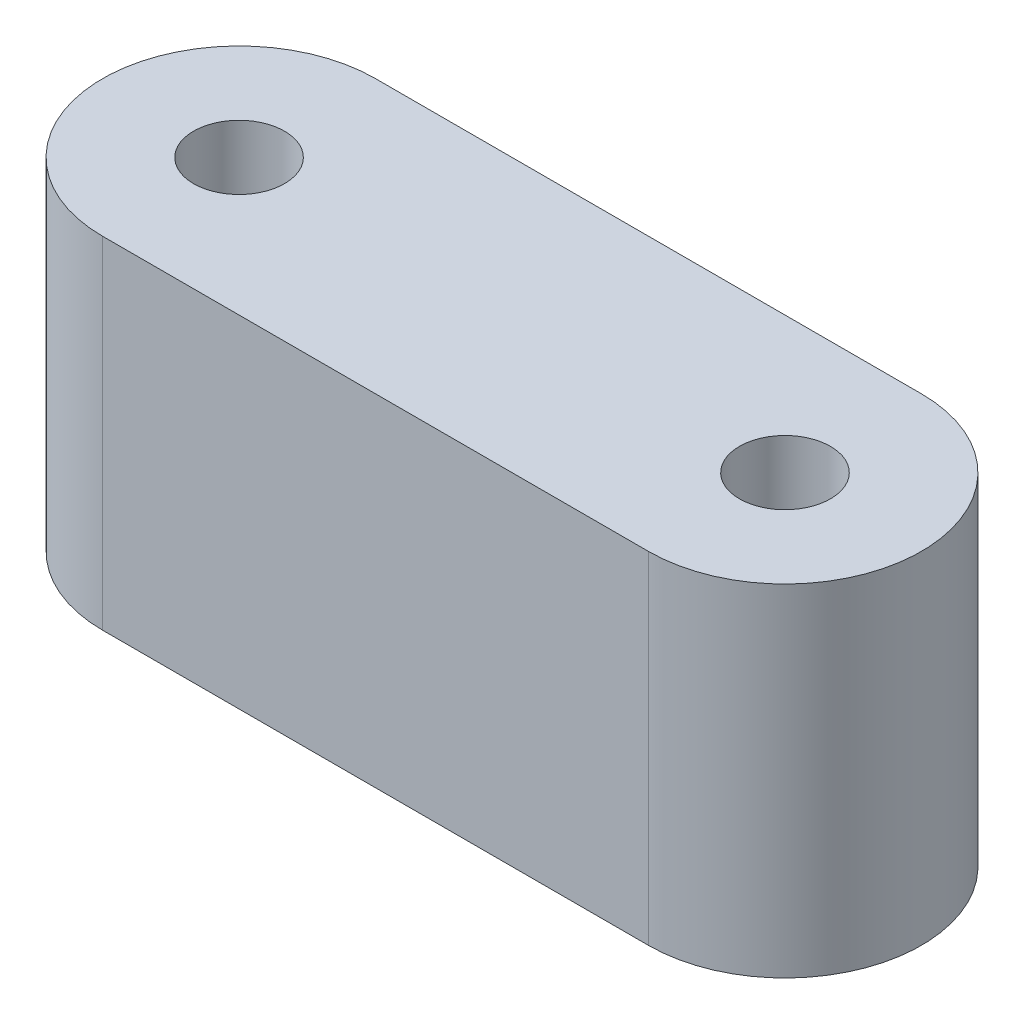
ISO-10303-21;
HEADER;
FILE_DESCRIPTION(('STEP AP214'),'2;1');
FILE_NAME('part.step','',(''),(''),'','','');
FILE_SCHEMA(('AUTOMOTIVE_DESIGN { 1 0 10303 214 1 1 1 1 }'));
ENDSEC;
DATA;
#1=APPLICATION_CONTEXT('core data for automotive mechanical design processes');
#2=APPLICATION_PROTOCOL_DEFINITION('international standard','automotive_design',2000,#1);
#3=PRODUCT_CONTEXT('',#1,'mechanical');
#4=PRODUCT('Part','Part','',(#3));
#5=PRODUCT_RELATED_PRODUCT_CATEGORY('part','',(#4));
#6=PRODUCT_DEFINITION_FORMATION('','',#4);
#7=PRODUCT_DEFINITION_CONTEXT('part definition',#1,'design');
#8=PRODUCT_DEFINITION('design','',#6,#7);
#9=PRODUCT_DEFINITION_SHAPE('','',#8);
#10=(LENGTH_UNIT() NAMED_UNIT(*) SI_UNIT(.MILLI.,.METRE.));
#11=(NAMED_UNIT(*) PLANE_ANGLE_UNIT() SI_UNIT($,.RADIAN.));
#12=(NAMED_UNIT(*) SI_UNIT($,.STERADIAN.) SOLID_ANGLE_UNIT());
#13=UNCERTAINTY_MEASURE_WITH_UNIT(LENGTH_MEASURE(1.E-05),#10,'distance_accuracy_value','');
#14=(GEOMETRIC_REPRESENTATION_CONTEXT(3) GLOBAL_UNCERTAINTY_ASSIGNED_CONTEXT((#13)) GLOBAL_UNIT_ASSIGNED_CONTEXT((#10,
#11,#12)) REPRESENTATION_CONTEXT('',''));
#15=CARTESIAN_POINT('',(0.,0.,0.));
#16=DIRECTION('',(0.,0.,1.));
#17=DIRECTION('',(1.,0.,0.));
#18=AXIS2_PLACEMENT_3D('',#15,#16,#17);
#19=CARTESIAN_POINT('',(-12.,15.,0.));
#20=DIRECTION('',(0.,1.,0.));
#21=DIRECTION('',(0.,0.,1.));
#22=AXIS2_PLACEMENT_3D('',#19,#20,#21);
#23=PLANE('',#22);
#24=CARTESIAN_POINT('',(-12.,15.,0.));
#25=DIRECTION('',(0.,1.,0.));
#26=DIRECTION('',(0.,0.,1.));
#27=AXIS2_PLACEMENT_3D('',#24,#25,#26);
#28=CIRCLE('',#27,2.);
#29=CARTESIAN_POINT('',(-12.,15.,2.));
#30=VERTEX_POINT('',#29);
#31=EDGE_CURVE('E104',#30,#30,#28,.T.);
#32=ORIENTED_EDGE('',*,*,#31,.F.);
#33=EDGE_LOOP('',(#32));
#34=FACE_BOUND('',#33,.T.);
#35=CARTESIAN_POINT('',(-12.,15.,0.));
#36=DIRECTION('',(0.,1.,0.));
#37=DIRECTION('',(0.,0.,1.));
#38=AXIS2_PLACEMENT_3D('',#35,#36,#37);
#39=CIRCLE('',#38,6.);
#40=CARTESIAN_POINT('',(-12.,15.,-6.));
#41=VERTEX_POINT('',#40);
#42=CARTESIAN_POINT('',(-12.,15.,6.));
#43=VERTEX_POINT('',#42);
#44=EDGE_CURVE('E89',#41,#43,#39,.T.);
#45=ORIENTED_EDGE('',*,*,#44,.T.);
#46=DIRECTION('',(1.,0.,0.));
#47=VECTOR('',#46,1.);
#48=CARTESIAN_POINT('',(-12.,15.,6.));
#49=LINE('',#48,#47);
#50=CARTESIAN_POINT('',(12.,15.,6.));
#51=VERTEX_POINT('',#50);
#52=EDGE_CURVE('E84',#43,#51,#49,.T.);
#53=ORIENTED_EDGE('',*,*,#52,.T.);
#54=CARTESIAN_POINT('',(12.,15.,0.));
#55=DIRECTION('',(0.,1.,0.));
#56=DIRECTION('',(0.,0.,1.));
#57=AXIS2_PLACEMENT_3D('',#54,#55,#56);
#58=CIRCLE('',#57,6.);
#59=CARTESIAN_POINT('',(12.,15.,-6.));
#60=VERTEX_POINT('',#59);
#61=EDGE_CURVE('E87',#51,#60,#58,.T.);
#62=ORIENTED_EDGE('',*,*,#61,.T.);
#63=DIRECTION('',(-1.,0.,0.));
#64=VECTOR('',#63,1.);
#65=CARTESIAN_POINT('',(-12.,15.,-6.));
#66=LINE('',#65,#64);
#67=EDGE_CURVE('E54',#60,#41,#66,.T.);
#68=ORIENTED_EDGE('',*,*,#67,.T.);
#69=EDGE_LOOP('',(#45,#53,#62,#68));
#70=FACE_BOUND('',#69,.T.);
#71=CARTESIAN_POINT('',(12.,15.,0.));
#72=DIRECTION('',(0.,1.,0.));
#73=DIRECTION('',(0.,0.,1.));
#74=AXIS2_PLACEMENT_3D('',#71,#72,#73);
#75=CIRCLE('',#74,2.);
#76=CARTESIAN_POINT('',(12.,15.,2.));
#77=VERTEX_POINT('',#76);
#78=EDGE_CURVE('E119',#77,#77,#75,.T.);
#79=ORIENTED_EDGE('',*,*,#78,.F.);
#80=EDGE_LOOP('',(#79));
#81=FACE_BOUND('',#80,.T.);
#82=ADVANCED_FACE('F37',(#34,#70,#81),#23,.T.);
#83=CARTESIAN_POINT('',(-12.,0.,0.));
#84=DIRECTION('',(0.,1.,0.));
#85=DIRECTION('',(0.,0.,1.));
#86=AXIS2_PLACEMENT_3D('',#83,#84,#85);
#87=PLANE('',#86);
#88=CARTESIAN_POINT('',(-12.,0.,0.));
#89=DIRECTION('',(0.,1.,0.));
#90=DIRECTION('',(0.,0.,1.));
#91=AXIS2_PLACEMENT_3D('',#88,#89,#90);
#92=CIRCLE('',#91,6.);
#93=CARTESIAN_POINT('',(-12.,0.,-6.));
#94=VERTEX_POINT('',#93);
#95=CARTESIAN_POINT('',(-12.,0.,6.));
#96=VERTEX_POINT('',#95);
#97=EDGE_CURVE('E101',#94,#96,#92,.T.);
#98=ORIENTED_EDGE('',*,*,#97,.F.);
#99=DIRECTION('',(-1.,0.,0.));
#100=VECTOR('',#99,1.);
#101=CARTESIAN_POINT('',(-12.,0.,-6.));
#102=LINE('',#101,#100);
#103=CARTESIAN_POINT('',(12.,0.,-6.));
#104=VERTEX_POINT('',#103);
#105=EDGE_CURVE('E77',#104,#94,#102,.T.);
#106=ORIENTED_EDGE('',*,*,#105,.F.);
#107=CARTESIAN_POINT('',(12.,0.,0.));
#108=DIRECTION('',(0.,1.,0.));
#109=DIRECTION('',(0.,0.,1.));
#110=AXIS2_PLACEMENT_3D('',#107,#108,#109);
#111=CIRCLE('',#110,6.);
#112=CARTESIAN_POINT('',(12.,0.,6.));
#113=VERTEX_POINT('',#112);
#114=EDGE_CURVE('E71',#113,#104,#111,.T.);
#115=ORIENTED_EDGE('',*,*,#114,.F.);
#116=DIRECTION('',(1.,0.,0.));
#117=VECTOR('',#116,1.);
#118=CARTESIAN_POINT('',(-12.,0.,6.));
#119=LINE('',#118,#117);
#120=EDGE_CURVE('E93',#96,#113,#119,.T.);
#121=ORIENTED_EDGE('',*,*,#120,.F.);
#122=EDGE_LOOP('',(#98,#106,#115,#121));
#123=FACE_BOUND('',#122,.T.);
#124=CARTESIAN_POINT('',(-12.,0.,0.));
#125=DIRECTION('',(0.,1.,0.));
#126=DIRECTION('',(0.,0.,1.));
#127=AXIS2_PLACEMENT_3D('',#124,#125,#126);
#128=CIRCLE('',#127,2.);
#129=CARTESIAN_POINT('',(-12.,0.,2.));
#130=VERTEX_POINT('',#129);
#131=EDGE_CURVE('E116',#130,#130,#128,.T.);
#132=ORIENTED_EDGE('',*,*,#131,.T.);
#133=EDGE_LOOP('',(#132));
#134=FACE_BOUND('',#133,.T.);
#135=CARTESIAN_POINT('',(12.,0.,0.));
#136=DIRECTION('',(0.,1.,0.));
#137=DIRECTION('',(0.,0.,1.));
#138=AXIS2_PLACEMENT_3D('',#135,#136,#137);
#139=CIRCLE('',#138,2.);
#140=CARTESIAN_POINT('',(12.,0.,2.));
#141=VERTEX_POINT('',#140);
#142=EDGE_CURVE('E122',#141,#141,#139,.T.);
#143=ORIENTED_EDGE('',*,*,#142,.T.);
#144=EDGE_LOOP('',(#143));
#145=FACE_BOUND('',#144,.T.);
#146=ADVANCED_FACE('F112',(#123,#134,#145),#87,.F.);
#147=CARTESIAN_POINT('',(-12.,15.,0.));
#148=DIRECTION('',(0.,-1.,0.));
#149=DIRECTION('',(0.,0.,-1.));
#150=AXIS2_PLACEMENT_3D('',#147,#148,#149);
#151=CYLINDRICAL_SURFACE('',#150,6.);
#152=ORIENTED_EDGE('',*,*,#97,.T.);
#153=DIRECTION('',(0.,-1.,0.));
#154=VECTOR('',#153,1.);
#155=CARTESIAN_POINT('',(-12.,15.,6.));
#156=LINE('',#155,#154);
#157=EDGE_CURVE('E11',#43,#96,#156,.T.);
#158=ORIENTED_EDGE('',*,*,#157,.F.);
#159=ORIENTED_EDGE('',*,*,#44,.F.);
#160=DIRECTION('',(0.,-1.,0.));
#161=VECTOR('',#160,1.);
#162=CARTESIAN_POINT('',(-12.,15.,-6.));
#163=LINE('',#162,#161);
#164=EDGE_CURVE('E97',#41,#94,#163,.T.);
#165=ORIENTED_EDGE('',*,*,#164,.T.);
#166=EDGE_LOOP('',(#152,#158,#159,#165));
#167=FACE_BOUND('',#166,.T.);
#168=ADVANCED_FACE('F39',(#167),#151,.T.);
#169=CARTESIAN_POINT('',(-12.,15.,6.));
#170=DIRECTION('',(0.,0.,-1.));
#171=DIRECTION('',(-1.,0.,0.));
#172=AXIS2_PLACEMENT_3D('',#169,#170,#171);
#173=PLANE('',#172);
#174=ORIENTED_EDGE('',*,*,#120,.T.);
#175=DIRECTION('',(0.,-1.,0.));
#176=VECTOR('',#175,1.);
#177=CARTESIAN_POINT('',(12.,15.,6.));
#178=LINE('',#177,#176);
#179=EDGE_CURVE('E46',#51,#113,#178,.T.);
#180=ORIENTED_EDGE('',*,*,#179,.F.);
#181=ORIENTED_EDGE('',*,*,#52,.F.);
#182=ORIENTED_EDGE('',*,*,#157,.T.);
#183=EDGE_LOOP('',(#174,#180,#181,#182));
#184=FACE_BOUND('',#183,.T.);
#185=ADVANCED_FACE('F92',(#184),#173,.F.);
#186=CARTESIAN_POINT('',(12.,15.,0.));
#187=DIRECTION('',(0.,-1.,0.));
#188=DIRECTION('',(0.,0.,-1.));
#189=AXIS2_PLACEMENT_3D('',#186,#187,#188);
#190=CYLINDRICAL_SURFACE('',#189,6.);
#191=ORIENTED_EDGE('',*,*,#114,.T.);
#192=DIRECTION('',(0.,-1.,0.));
#193=VECTOR('',#192,1.);
#194=CARTESIAN_POINT('',(12.,15.,-6.));
#195=LINE('',#194,#193);
#196=EDGE_CURVE('E94',#60,#104,#195,.T.);
#197=ORIENTED_EDGE('',*,*,#196,.F.);
#198=ORIENTED_EDGE('',*,*,#61,.F.);
#199=ORIENTED_EDGE('',*,*,#179,.T.);
#200=EDGE_LOOP('',(#191,#197,#198,#199));
#201=FACE_BOUND('',#200,.T.);
#202=ADVANCED_FACE('F95',(#201),#190,.T.);
#203=CARTESIAN_POINT('',(-12.,15.,-6.));
#204=DIRECTION('',(0.,0.,1.));
#205=DIRECTION('',(1.,0.,0.));
#206=AXIS2_PLACEMENT_3D('',#203,#204,#205);
#207=PLANE('',#206);
#208=ORIENTED_EDGE('',*,*,#105,.T.);
#209=ORIENTED_EDGE('',*,*,#164,.F.);
#210=ORIENTED_EDGE('',*,*,#67,.F.);
#211=ORIENTED_EDGE('',*,*,#196,.T.);
#212=EDGE_LOOP('',(#208,#209,#210,#211));
#213=FACE_BOUND('',#212,.T.);
#214=ADVANCED_FACE('F109',(#213),#207,.F.);
#215=CARTESIAN_POINT('',(-12.,15.,0.));
#216=DIRECTION('',(0.,-1.,0.));
#217=DIRECTION('',(0.,0.,-1.));
#218=AXIS2_PLACEMENT_3D('',#215,#216,#217);
#219=CYLINDRICAL_SURFACE('',#218,2.);
#220=ORIENTED_EDGE('',*,*,#31,.T.);
#221=EDGE_LOOP('',(#220));
#222=FACE_BOUND('',#221,.T.);
#223=ORIENTED_EDGE('',*,*,#131,.F.);
#224=EDGE_LOOP('',(#223));
#225=FACE_BOUND('',#224,.T.);
#226=ADVANCED_FACE('F139',(#222,#225),#219,.F.);
#227=CARTESIAN_POINT('',(12.,15.,0.));
#228=DIRECTION('',(0.,-1.,0.));
#229=DIRECTION('',(0.,0.,-1.));
#230=AXIS2_PLACEMENT_3D('',#227,#228,#229);
#231=CYLINDRICAL_SURFACE('',#230,2.);
#232=ORIENTED_EDGE('',*,*,#78,.T.);
#233=EDGE_LOOP('',(#232));
#234=FACE_BOUND('',#233,.T.);
#235=ORIENTED_EDGE('',*,*,#142,.F.);
#236=EDGE_LOOP('',(#235));
#237=FACE_BOUND('',#236,.T.);
#238=ADVANCED_FACE('F128',(#234,#237),#231,.F.);
#239=CLOSED_SHELL('',(#82,#146,#168,#185,#202,#214,#226,#238));
#240=MANIFOLD_SOLID_BREP('B2',#239);
#241=ADVANCED_BREP_SHAPE_REPRESENTATION('',(#18,#240),#14);
#242=SHAPE_DEFINITION_REPRESENTATION(#9,#241);
ENDSEC;
END-ISO-10303-21;
